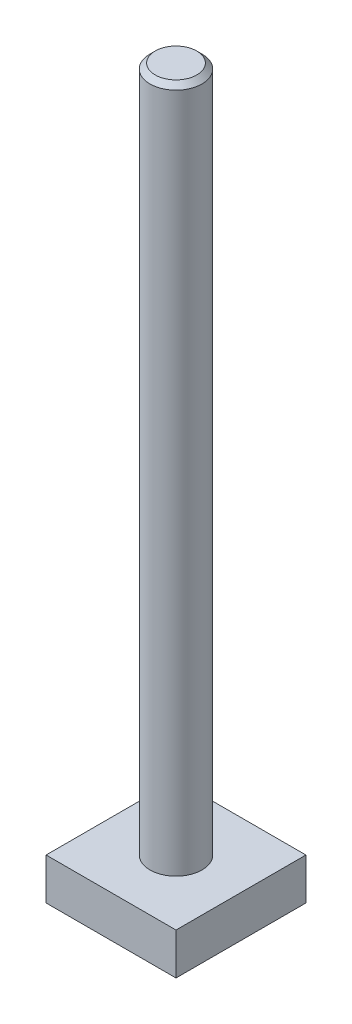
ISO-10303-21;
HEADER;
FILE_DESCRIPTION(('STEP AP214'),'2;1');
FILE_NAME('part.step','',(''),(''),'','','');
FILE_SCHEMA(('AUTOMOTIVE_DESIGN { 1 0 10303 214 1 1 1 1 }'));
ENDSEC;
DATA;
#1=APPLICATION_CONTEXT('core data for automotive mechanical design processes');
#2=APPLICATION_PROTOCOL_DEFINITION('international standard','automotive_design',2000,#1);
#3=PRODUCT_CONTEXT('',#1,'mechanical');
#4=PRODUCT('Part','Part','',(#3));
#5=PRODUCT_RELATED_PRODUCT_CATEGORY('part','',(#4));
#6=PRODUCT_DEFINITION_FORMATION('','',#4);
#7=PRODUCT_DEFINITION_CONTEXT('part definition',#1,'design');
#8=PRODUCT_DEFINITION('design','',#6,#7);
#9=PRODUCT_DEFINITION_SHAPE('','',#8);
#10=(LENGTH_UNIT() NAMED_UNIT(*) SI_UNIT(.MILLI.,.METRE.));
#11=(NAMED_UNIT(*) PLANE_ANGLE_UNIT() SI_UNIT($,.RADIAN.));
#12=(NAMED_UNIT(*) SI_UNIT($,.STERADIAN.) SOLID_ANGLE_UNIT());
#13=UNCERTAINTY_MEASURE_WITH_UNIT(LENGTH_MEASURE(1.E-05),#10,'distance_accuracy_value','');
#14=(GEOMETRIC_REPRESENTATION_CONTEXT(3) GLOBAL_UNCERTAINTY_ASSIGNED_CONTEXT((#13)) GLOBAL_UNIT_ASSIGNED_CONTEXT((#10,
#11,#12)) REPRESENTATION_CONTEXT('',''));
#15=CARTESIAN_POINT('',(0.,0.,0.));
#16=DIRECTION('',(0.,0.,1.));
#17=DIRECTION('',(1.,0.,0.));
#18=AXIS2_PLACEMENT_3D('',#15,#16,#17);
#19=CARTESIAN_POINT('',(12.5,8.,-12.5));
#20=DIRECTION('',(-1.,0.,0.));
#21=DIRECTION('',(0.,0.,1.));
#22=AXIS2_PLACEMENT_3D('',#19,#20,#21);
#23=PLANE('',#22);
#24=DIRECTION('',(0.,0.,-1.));
#25=VECTOR('',#24,1.);
#26=CARTESIAN_POINT('',(12.5,0.,-12.5));
#27=LINE('',#26,#25);
#28=CARTESIAN_POINT('',(12.5,0.,12.5));
#29=VERTEX_POINT('',#28);
#30=CARTESIAN_POINT('',(12.5,0.,-12.5));
#31=VERTEX_POINT('',#30);
#32=EDGE_CURVE('E118',#29,#31,#27,.T.);
#33=ORIENTED_EDGE('',*,*,#32,.T.);
#34=DIRECTION('',(0.,-1.,0.));
#35=VECTOR('',#34,1.);
#36=CARTESIAN_POINT('',(12.5,8.,-12.5));
#37=LINE('',#36,#35);
#38=CARTESIAN_POINT('',(12.5,8.,-12.5));
#39=VERTEX_POINT('',#38);
#40=EDGE_CURVE('E109',#39,#31,#37,.T.);
#41=ORIENTED_EDGE('',*,*,#40,.F.);
#42=DIRECTION('',(0.,0.,-1.));
#43=VECTOR('',#42,1.);
#44=CARTESIAN_POINT('',(12.5,8.,-12.5));
#45=LINE('',#44,#43);
#46=CARTESIAN_POINT('',(12.5,8.,12.5));
#47=VERTEX_POINT('',#46);
#48=EDGE_CURVE('E103',#47,#39,#45,.T.);
#49=ORIENTED_EDGE('',*,*,#48,.F.);
#50=DIRECTION('',(0.,-1.,0.));
#51=VECTOR('',#50,1.);
#52=CARTESIAN_POINT('',(12.5,8.,12.5));
#53=LINE('',#52,#51);
#54=EDGE_CURVE('E114',#47,#29,#53,.T.);
#55=ORIENTED_EDGE('',*,*,#54,.T.);
#56=EDGE_LOOP('',(#33,#41,#49,#55));
#57=FACE_BOUND('',#56,.T.);
#58=ADVANCED_FACE('F49',(#57),#23,.F.);
#59=CARTESIAN_POINT('',(-12.5,8.,-12.5));
#60=DIRECTION('',(0.,0.,1.));
#61=DIRECTION('',(1.,0.,0.));
#62=AXIS2_PLACEMENT_3D('',#59,#60,#61);
#63=PLANE('',#62);
#64=DIRECTION('',(-1.,0.,0.));
#65=VECTOR('',#64,1.);
#66=CARTESIAN_POINT('',(-12.5,0.,-12.5));
#67=LINE('',#66,#65);
#68=CARTESIAN_POINT('',(-12.5,0.,-12.5));
#69=VERTEX_POINT('',#68);
#70=EDGE_CURVE('E108',#31,#69,#67,.T.);
#71=ORIENTED_EDGE('',*,*,#70,.T.);
#72=DIRECTION('',(0.,-1.,0.));
#73=VECTOR('',#72,1.);
#74=CARTESIAN_POINT('',(-12.5,8.,-12.5));
#75=LINE('',#74,#73);
#76=CARTESIAN_POINT('',(-12.5,8.,-12.5));
#77=VERTEX_POINT('',#76);
#78=EDGE_CURVE('E106',#77,#69,#75,.T.);
#79=ORIENTED_EDGE('',*,*,#78,.F.);
#80=DIRECTION('',(-1.,0.,0.));
#81=VECTOR('',#80,1.);
#82=CARTESIAN_POINT('',(-12.5,8.,-12.5));
#83=LINE('',#82,#81);
#84=EDGE_CURVE('E98',#39,#77,#83,.T.);
#85=ORIENTED_EDGE('',*,*,#84,.F.);
#86=ORIENTED_EDGE('',*,*,#40,.T.);
#87=EDGE_LOOP('',(#71,#79,#85,#86));
#88=FACE_BOUND('',#87,.T.);
#89=ADVANCED_FACE('F107',(#88),#63,.F.);
#90=CARTESIAN_POINT('',(-12.5,8.,-12.5));
#91=DIRECTION('',(1.,0.,0.));
#92=DIRECTION('',(0.,0.,-1.));
#93=AXIS2_PLACEMENT_3D('',#90,#91,#92);
#94=PLANE('',#93);
#95=DIRECTION('',(0.,0.,1.));
#96=VECTOR('',#95,1.);
#97=CARTESIAN_POINT('',(-12.5,0.,-12.5));
#98=LINE('',#97,#96);
#99=CARTESIAN_POINT('',(-12.5,0.,12.5));
#100=VERTEX_POINT('',#99);
#101=EDGE_CURVE('E84',#69,#100,#98,.T.);
#102=ORIENTED_EDGE('',*,*,#101,.T.);
#103=DIRECTION('',(0.,-1.,0.));
#104=VECTOR('',#103,1.);
#105=CARTESIAN_POINT('',(-12.5,8.,12.5));
#106=LINE('',#105,#104);
#107=CARTESIAN_POINT('',(-12.5,8.,12.5));
#108=VERTEX_POINT('',#107);
#109=EDGE_CURVE('E110',#108,#100,#106,.T.);
#110=ORIENTED_EDGE('',*,*,#109,.F.);
#111=DIRECTION('',(0.,0.,1.));
#112=VECTOR('',#111,1.);
#113=CARTESIAN_POINT('',(-12.5,8.,-12.5));
#114=LINE('',#113,#112);
#115=EDGE_CURVE('E101',#77,#108,#114,.T.);
#116=ORIENTED_EDGE('',*,*,#115,.F.);
#117=ORIENTED_EDGE('',*,*,#78,.T.);
#118=EDGE_LOOP('',(#102,#110,#116,#117));
#119=FACE_BOUND('',#118,.T.);
#120=ADVANCED_FACE('F112',(#119),#94,.F.);
#121=CARTESIAN_POINT('',(-12.5,8.,12.5));
#122=DIRECTION('',(0.,0.,-1.));
#123=DIRECTION('',(-1.,0.,0.));
#124=AXIS2_PLACEMENT_3D('',#121,#122,#123);
#125=PLANE('',#124);
#126=DIRECTION('',(1.,0.,0.));
#127=VECTOR('',#126,1.);
#128=CARTESIAN_POINT('',(-12.5,0.,12.5));
#129=LINE('',#128,#127);
#130=EDGE_CURVE('E90',#100,#29,#129,.T.);
#131=ORIENTED_EDGE('',*,*,#130,.T.);
#132=ORIENTED_EDGE('',*,*,#54,.F.);
#133=DIRECTION('',(1.,0.,0.));
#134=VECTOR('',#133,1.);
#135=CARTESIAN_POINT('',(-12.5,8.,12.5));
#136=LINE('',#135,#134);
#137=EDGE_CURVE('E67',#108,#47,#136,.T.);
#138=ORIENTED_EDGE('',*,*,#137,.F.);
#139=ORIENTED_EDGE('',*,*,#109,.T.);
#140=EDGE_LOOP('',(#131,#132,#138,#139));
#141=FACE_BOUND('',#140,.T.);
#142=ADVANCED_FACE('F138',(#141),#125,.F.);
#143=CARTESIAN_POINT('',(0.,8.,0.));
#144=DIRECTION('',(0.,1.,0.));
#145=DIRECTION('',(0.,0.,1.));
#146=AXIS2_PLACEMENT_3D('',#143,#144,#145);
#147=PLANE('',#146);
#148=CARTESIAN_POINT('',(0.,8.,0.));
#149=DIRECTION('',(0.,1.,0.));
#150=DIRECTION('',(0.,0.,1.));
#151=AXIS2_PLACEMENT_3D('',#148,#149,#150);
#152=CIRCLE('',#151,5.);
#153=CARTESIAN_POINT('',(0.,8.,5.));
#154=VERTEX_POINT('',#153);
#155=EDGE_CURVE('E126',#154,#154,#152,.T.);
#156=ORIENTED_EDGE('',*,*,#155,.F.);
#157=EDGE_LOOP('',(#156));
#158=FACE_BOUND('',#157,.T.);
#159=ORIENTED_EDGE('',*,*,#48,.T.);
#160=ORIENTED_EDGE('',*,*,#84,.T.);
#161=ORIENTED_EDGE('',*,*,#115,.T.);
#162=ORIENTED_EDGE('',*,*,#137,.T.);
#163=EDGE_LOOP('',(#159,#160,#161,#162));
#164=FACE_BOUND('',#163,.T.);
#165=ADVANCED_FACE('F99',(#158,#164),#147,.T.);
#166=CARTESIAN_POINT('',(0.,0.,0.));
#167=DIRECTION('',(0.,1.,0.));
#168=DIRECTION('',(0.,0.,1.));
#169=AXIS2_PLACEMENT_3D('',#166,#167,#168);
#170=PLANE('',#169);
#171=ORIENTED_EDGE('',*,*,#32,.F.);
#172=ORIENTED_EDGE('',*,*,#130,.F.);
#173=ORIENTED_EDGE('',*,*,#101,.F.);
#174=ORIENTED_EDGE('',*,*,#70,.F.);
#175=EDGE_LOOP('',(#171,#172,#173,#174));
#176=FACE_BOUND('',#175,.T.);
#177=ADVANCED_FACE('F137',(#176),#170,.F.);
#178=CARTESIAN_POINT('',(0.,140.,0.));
#179=DIRECTION('',(0.,-1.,0.));
#180=DIRECTION('',(0.,0.,-1.));
#181=AXIS2_PLACEMENT_3D('',#178,#179,#180);
#182=CYLINDRICAL_SURFACE('',#181,5.);
#183=CARTESIAN_POINT('',(0.,139.,0.));
#184=DIRECTION('',(0.,1.,0.));
#185=DIRECTION('',(0.,0.,1.));
#186=AXIS2_PLACEMENT_3D('',#183,#184,#185);
#187=CIRCLE('',#186,5.);
#188=CARTESIAN_POINT('',(0.,139.,5.));
#189=VERTEX_POINT('',#188);
#190=EDGE_CURVE('E11',#189,#189,#187,.F.);
#191=ORIENTED_EDGE('',*,*,#190,.T.);
#192=EDGE_LOOP('',(#191));
#193=FACE_BOUND('',#192,.T.);
#194=ORIENTED_EDGE('',*,*,#155,.T.);
#195=EDGE_LOOP('',(#194));
#196=FACE_BOUND('',#195,.T.);
#197=ADVANCED_FACE('F134',(#193,#196),#182,.T.);
#198=CARTESIAN_POINT('',(0.,140.,0.));
#199=DIRECTION('',(0.,1.,0.));
#200=DIRECTION('',(0.,0.,1.));
#201=AXIS2_PLACEMENT_3D('',#198,#199,#200);
#202=PLANE('',#201);
#203=CARTESIAN_POINT('',(0.,140.,0.));
#204=DIRECTION('',(0.,1.,0.));
#205=DIRECTION('',(0.,0.,1.));
#206=AXIS2_PLACEMENT_3D('',#203,#204,#205);
#207=CIRCLE('',#206,4.);
#208=CARTESIAN_POINT('',(0.,140.,4.));
#209=VERTEX_POINT('',#208);
#210=EDGE_CURVE('E59',#209,#209,#207,.T.);
#211=ORIENTED_EDGE('',*,*,#210,.T.);
#212=EDGE_LOOP('',(#211));
#213=FACE_BOUND('',#212,.T.);
#214=ADVANCED_FACE('F187',(#213),#202,.T.);
#215=CARTESIAN_POINT('',(0.,140.,0.));
#216=DIRECTION('',(0.,-1.,0.));
#217=DIRECTION('',(0.,0.,-1.));
#218=AXIS2_PLACEMENT_3D('',#215,#216,#217);
#219=CONICAL_SURFACE('',#218,4.,0.785398163397446);
#220=ORIENTED_EDGE('',*,*,#190,.F.);
#221=EDGE_LOOP('',(#220));
#222=FACE_BOUND('',#221,.T.);
#223=ORIENTED_EDGE('',*,*,#210,.F.);
#224=EDGE_LOOP('',(#223));
#225=FACE_BOUND('',#224,.T.);
#226=ADVANCED_FACE('F52',(#222,#225),#219,.T.);
#227=CLOSED_SHELL('',(#58,#89,#120,#142,#165,#177,#197,#214,#226));
#228=MANIFOLD_SOLID_BREP('B2',#227);
#229=ADVANCED_BREP_SHAPE_REPRESENTATION('',(#18,#228),#14);
#230=SHAPE_DEFINITION_REPRESENTATION(#9,#229);
ENDSEC;
END-ISO-10303-21;
